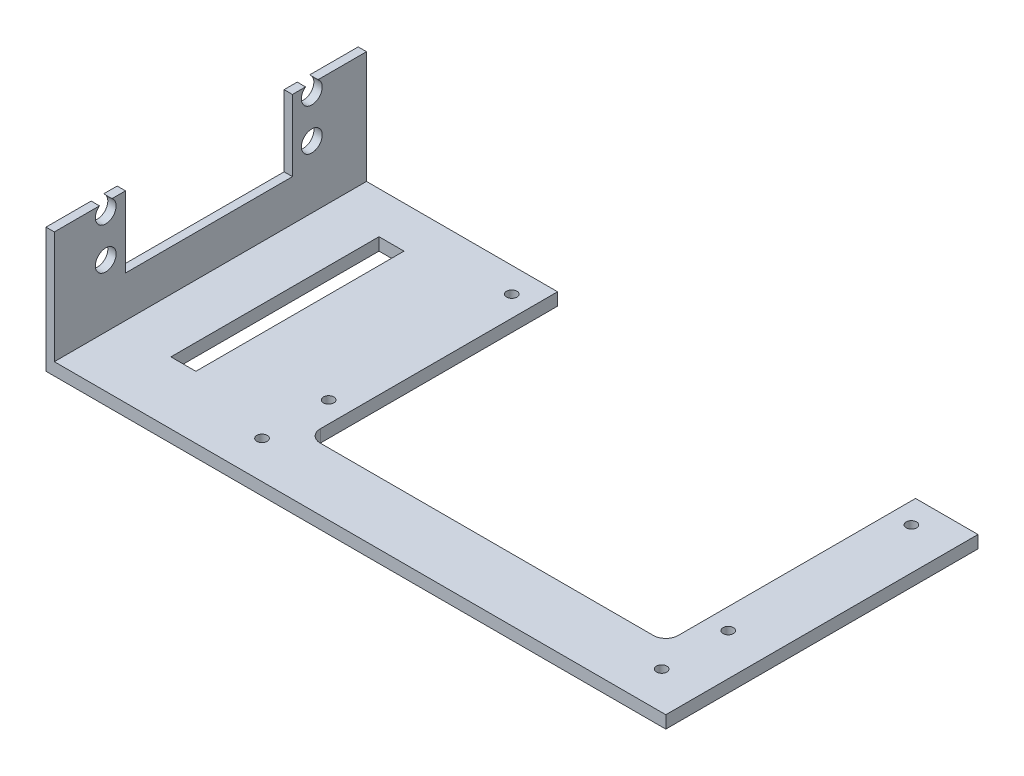
ISO-10303-21;
HEADER;
FILE_DESCRIPTION(('STEP AP214'),'2;1');
FILE_NAME('part.step','',(''),(''),'','','');
FILE_SCHEMA(('AUTOMOTIVE_DESIGN { 1 0 10303 214 1 1 1 1 }'));
ENDSEC;
DATA;
#1=APPLICATION_CONTEXT('core data for automotive mechanical design processes');
#2=APPLICATION_PROTOCOL_DEFINITION('international standard','automotive_design',2000,#1);
#3=PRODUCT_CONTEXT('',#1,'mechanical');
#4=PRODUCT('Part','Part','',(#3));
#5=PRODUCT_RELATED_PRODUCT_CATEGORY('part','',(#4));
#6=PRODUCT_DEFINITION_FORMATION('','',#4);
#7=PRODUCT_DEFINITION_CONTEXT('part definition',#1,'design');
#8=PRODUCT_DEFINITION('design','',#6,#7);
#9=PRODUCT_DEFINITION_SHAPE('','',#8);
#10=(LENGTH_UNIT() NAMED_UNIT(*) SI_UNIT(.MILLI.,.METRE.));
#11=(NAMED_UNIT(*) PLANE_ANGLE_UNIT() SI_UNIT($,.RADIAN.));
#12=(NAMED_UNIT(*) SI_UNIT($,.STERADIAN.) SOLID_ANGLE_UNIT());
#13=UNCERTAINTY_MEASURE_WITH_UNIT(LENGTH_MEASURE(1.E-05),#10,'distance_accuracy_value','');
#14=(GEOMETRIC_REPRESENTATION_CONTEXT(3) GLOBAL_UNCERTAINTY_ASSIGNED_CONTEXT((#13)) GLOBAL_UNIT_ASSIGNED_CONTEXT((#10,
#11,#12)) REPRESENTATION_CONTEXT('',''));
#15=CARTESIAN_POINT('',(0.,0.,0.));
#16=DIRECTION('',(0.,0.,1.));
#17=DIRECTION('',(1.,0.,0.));
#18=AXIS2_PLACEMENT_3D('',#15,#16,#17);
#19=CARTESIAN_POINT('',(0.,3.,0.));
#20=DIRECTION('',(0.,-1.,0.));
#21=DIRECTION('',(0.,0.,-1.));
#22=AXIS2_PLACEMENT_3D('',#19,#20,#21);
#23=PLANE('',#22);
#24=DIRECTION('',(1.,0.,0.));
#25=VECTOR('',#24,1.);
#26=CARTESIAN_POINT('',(-32.9,3.,0.));
#27=LINE('',#26,#25);
#28=CARTESIAN_POINT('',(-32.9,3.,0.));
#29=VERTEX_POINT('',#28);
#30=CARTESIAN_POINT('',(-26.9,3.,0.));
#31=VERTEX_POINT('',#30);
#32=EDGE_CURVE('E231',#29,#31,#27,.T.);
#33=ORIENTED_EDGE('',*,*,#32,.F.);
#34=DIRECTION('',(0.,0.,1.));
#35=VECTOR('',#34,1.);
#36=CARTESIAN_POINT('',(-32.9,3.,-50.));
#37=LINE('',#36,#35);
#38=CARTESIAN_POINT('',(-32.9,3.,-50.));
#39=VERTEX_POINT('',#38);
#40=EDGE_CURVE('E58',#39,#29,#37,.T.);
#41=ORIENTED_EDGE('',*,*,#40,.F.);
#42=DIRECTION('',(-1.,0.,0.));
#43=VECTOR('',#42,1.);
#44=CARTESIAN_POINT('',(-32.9,3.,-50.));
#45=LINE('',#44,#43);
#46=CARTESIAN_POINT('',(-26.9,3.,-50.));
#47=VERTEX_POINT('',#46);
#48=EDGE_CURVE('E222',#47,#39,#45,.T.);
#49=ORIENTED_EDGE('',*,*,#48,.F.);
#50=DIRECTION('',(0.,0.,-1.));
#51=VECTOR('',#50,1.);
#52=CARTESIAN_POINT('',(-26.9,3.,-50.));
#53=LINE('',#52,#51);
#54=EDGE_CURVE('E225',#31,#47,#53,.T.);
#55=ORIENTED_EDGE('',*,*,#54,.F.);
#56=EDGE_LOOP('',(#33,#41,#49,#55));
#57=FACE_BOUND('',#56,.T.);
#58=CARTESIAN_POINT('',(-5.,3.,-9.99999999999999));
#59=DIRECTION('',(0.,1.,0.));
#60=DIRECTION('',(0.,0.,-1.));
#61=AXIS2_PLACEMENT_3D('',#58,#59,#60);
#62=CIRCLE('',#61,1.25);
#63=CARTESIAN_POINT('',(-5.,3.,-11.25));
#64=VERTEX_POINT('',#63);
#65=EDGE_CURVE('E325',#64,#64,#62,.T.);
#66=ORIENTED_EDGE('',*,*,#65,.F.);
#67=EDGE_LOOP('',(#66));
#68=FACE_BOUND('',#67,.T.);
#69=CARTESIAN_POINT('',(91.,3.,-9.99999999999999));
#70=DIRECTION('',(0.,1.,0.));
#71=DIRECTION('',(0.,0.,1.));
#72=AXIS2_PLACEMENT_3D('',#69,#70,#71);
#73=CIRCLE('',#72,1.25);
#74=CARTESIAN_POINT('',(91.,3.,-8.75));
#75=VERTEX_POINT('',#74);
#76=EDGE_CURVE('E331',#75,#75,#73,.T.);
#77=ORIENTED_EDGE('',*,*,#76,.F.);
#78=EDGE_LOOP('',(#77));
#79=FACE_BOUND('',#78,.T.);
#80=CARTESIAN_POINT('',(91.,3.,6.00000000000001));
#81=DIRECTION('',(0.,1.,0.));
#82=DIRECTION('',(0.,0.,1.));
#83=AXIS2_PLACEMENT_3D('',#80,#81,#82);
#84=CIRCLE('',#83,1.25);
#85=CARTESIAN_POINT('',(91.,3.,7.25));
#86=VERTEX_POINT('',#85);
#87=EDGE_CURVE('E337',#86,#86,#84,.T.);
#88=ORIENTED_EDGE('',*,*,#87,.F.);
#89=EDGE_LOOP('',(#88));
#90=FACE_BOUND('',#89,.T.);
#91=CARTESIAN_POINT('',(91.,3.,-54.));
#92=DIRECTION('',(0.,1.,0.));
#93=DIRECTION('',(0.,0.,1.));
#94=AXIS2_PLACEMENT_3D('',#91,#92,#93);
#95=CIRCLE('',#94,1.25);
#96=CARTESIAN_POINT('',(91.,3.,-52.75));
#97=VERTEX_POINT('',#96);
#98=EDGE_CURVE('E343',#97,#97,#95,.T.);
#99=ORIENTED_EDGE('',*,*,#98,.F.);
#100=EDGE_LOOP('',(#99));
#101=FACE_BOUND('',#100,.T.);
#102=CARTESIAN_POINT('',(-5.,3.,6.00000000000001));
#103=DIRECTION('',(0.,1.,0.));
#104=DIRECTION('',(0.,0.,-1.));
#105=AXIS2_PLACEMENT_3D('',#102,#103,#104);
#106=CIRCLE('',#105,1.25);
#107=CARTESIAN_POINT('',(-5.,3.,4.75000000000001));
#108=VERTEX_POINT('',#107);
#109=EDGE_CURVE('E349',#108,#108,#106,.T.);
#110=ORIENTED_EDGE('',*,*,#109,.F.);
#111=EDGE_LOOP('',(#110));
#112=FACE_BOUND('',#111,.T.);
#113=CARTESIAN_POINT('',(-5.,3.,-54.));
#114=DIRECTION('',(0.,1.,0.));
#115=DIRECTION('',(0.,0.,1.));
#116=AXIS2_PLACEMENT_3D('',#113,#114,#115);
#117=CIRCLE('',#116,1.25);
#118=CARTESIAN_POINT('',(-5.,3.,-52.75));
#119=VERTEX_POINT('',#118);
#120=EDGE_CURVE('E355',#119,#119,#117,.T.);
#121=ORIENTED_EDGE('',*,*,#120,.F.);
#122=EDGE_LOOP('',(#121));
#123=FACE_BOUND('',#122,.T.);
#124=DIRECTION('',(0.,0.,-1.));
#125=VECTOR('',#124,1.);
#126=CARTESIAN_POINT('',(-45.9,3.,-60.));
#127=LINE('',#126,#125);
#128=CARTESIAN_POINT('',(-45.9,3.,15.));
#129=VERTEX_POINT('',#128);
#130=CARTESIAN_POINT('',(-45.9,3.,-60.));
#131=VERTEX_POINT('',#130);
#132=EDGE_CURVE('E307',#129,#131,#127,.T.);
#133=ORIENTED_EDGE('',*,*,#132,.F.);
#134=DIRECTION('',(1.,0.,0.));
#135=VECTOR('',#134,1.);
#136=CARTESIAN_POINT('',(-15.,3.,15.));
#137=LINE('',#136,#135);
#138=CARTESIAN_POINT('',(101.,3.,15.));
#139=VERTEX_POINT('',#138);
#140=EDGE_CURVE('E370',#129,#139,#137,.T.);
#141=ORIENTED_EDGE('',*,*,#140,.T.);
#142=DIRECTION('',(0.,0.,-1.));
#143=VECTOR('',#142,1.);
#144=CARTESIAN_POINT('',(101.,3.,15.));
#145=LINE('',#144,#143);
#146=CARTESIAN_POINT('',(101.,3.,-60.));
#147=VERTEX_POINT('',#146);
#148=EDGE_CURVE('E372',#139,#147,#145,.T.);
#149=ORIENTED_EDGE('',*,*,#148,.T.);
#150=DIRECTION('',(-1.,0.,0.));
#151=VECTOR('',#150,1.);
#152=CARTESIAN_POINT('',(101.,3.,-60.));
#153=LINE('',#152,#151);
#154=CARTESIAN_POINT('',(86.,3.,-60.));
#155=VERTEX_POINT('',#154);
#156=EDGE_CURVE('E374',#147,#155,#153,.T.);
#157=ORIENTED_EDGE('',*,*,#156,.T.);
#158=DIRECTION('',(0.,0.,1.));
#159=VECTOR('',#158,1.);
#160=CARTESIAN_POINT('',(86.,3.,-60.));
#161=LINE('',#160,#159);
#162=CARTESIAN_POINT('',(86.,3.,-3.));
#163=VERTEX_POINT('',#162);
#164=EDGE_CURVE('E376',#155,#163,#161,.T.);
#165=ORIENTED_EDGE('',*,*,#164,.T.);
#166=CARTESIAN_POINT('',(83.,3.,-3.));
#167=DIRECTION('',(0.,-1.,0.));
#168=DIRECTION('',(0.,0.,-1.));
#169=AXIS2_PLACEMENT_3D('',#166,#167,#168);
#170=CIRCLE('',#169,3.);
#171=CARTESIAN_POINT('',(83.,3.,0.));
#172=VERTEX_POINT('',#171);
#173=EDGE_CURVE('E418',#163,#172,#170,.T.);
#174=ORIENTED_EDGE('',*,*,#173,.T.);
#175=DIRECTION('',(-1.,0.,0.));
#176=VECTOR('',#175,1.);
#177=CARTESIAN_POINT('',(86.,3.,0.));
#178=LINE('',#177,#176);
#179=CARTESIAN_POINT('',(3.,3.,0.));
#180=VERTEX_POINT('',#179);
#181=EDGE_CURVE('E361',#172,#180,#178,.T.);
#182=ORIENTED_EDGE('',*,*,#181,.T.);
#183=CARTESIAN_POINT('',(3.,3.,-3.));
#184=DIRECTION('',(0.,-1.,0.));
#185=DIRECTION('',(0.,0.,-1.));
#186=AXIS2_PLACEMENT_3D('',#183,#184,#185);
#187=CIRCLE('',#186,3.);
#188=CARTESIAN_POINT('',(0.,3.,-3.));
#189=VERTEX_POINT('',#188);
#190=EDGE_CURVE('E422',#180,#189,#187,.T.);
#191=ORIENTED_EDGE('',*,*,#190,.T.);
#192=DIRECTION('',(0.,0.,-1.));
#193=VECTOR('',#192,1.);
#194=CARTESIAN_POINT('',(0.,3.,0.));
#195=LINE('',#194,#193);
#196=CARTESIAN_POINT('',(0.,3.,-60.));
#197=VERTEX_POINT('',#196);
#198=EDGE_CURVE('E364',#189,#197,#195,.T.);
#199=ORIENTED_EDGE('',*,*,#198,.T.);
#200=DIRECTION('',(-1.,0.,0.));
#201=VECTOR('',#200,1.);
#202=CARTESIAN_POINT('',(0.,3.,-60.));
#203=LINE('',#202,#201);
#204=EDGE_CURVE('E367',#197,#131,#203,.T.);
#205=ORIENTED_EDGE('',*,*,#204,.T.);
#206=EDGE_LOOP('',(#133,#141,#149,#157,#165,#174,#182,#191,#199,#205));
#207=FACE_BOUND('',#206,.T.);
#208=ADVANCED_FACE('F43',(#57,#68,#79,#90,#101,#112,#123,#207),#23,.F.);
#209=CARTESIAN_POINT('',(0.,0.,0.));
#210=DIRECTION('',(0.,-1.,0.));
#211=DIRECTION('',(0.,0.,-1.));
#212=AXIS2_PLACEMENT_3D('',#209,#210,#211);
#213=PLANE('',#212);
#214=DIRECTION('',(0.,0.,1.));
#215=VECTOR('',#214,1.);
#216=CARTESIAN_POINT('',(-32.9,0.,-50.));
#217=LINE('',#216,#215);
#218=CARTESIAN_POINT('',(-32.9,0.,-50.));
#219=VERTEX_POINT('',#218);
#220=CARTESIAN_POINT('',(-32.9,0.,0.));
#221=VERTEX_POINT('',#220);
#222=EDGE_CURVE('E206',#219,#221,#217,.T.);
#223=ORIENTED_EDGE('',*,*,#222,.T.);
#224=DIRECTION('',(1.,0.,0.));
#225=VECTOR('',#224,1.);
#226=CARTESIAN_POINT('',(-32.9,0.,0.));
#227=LINE('',#226,#225);
#228=CARTESIAN_POINT('',(-26.9,0.,0.));
#229=VERTEX_POINT('',#228);
#230=EDGE_CURVE('E215',#221,#229,#227,.T.);
#231=ORIENTED_EDGE('',*,*,#230,.T.);
#232=DIRECTION('',(0.,0.,-1.));
#233=VECTOR('',#232,1.);
#234=CARTESIAN_POINT('',(-26.9,0.,-50.));
#235=LINE('',#234,#233);
#236=CARTESIAN_POINT('',(-26.9,0.,-50.));
#237=VERTEX_POINT('',#236);
#238=EDGE_CURVE('E66',#229,#237,#235,.T.);
#239=ORIENTED_EDGE('',*,*,#238,.T.);
#240=DIRECTION('',(-1.,0.,0.));
#241=VECTOR('',#240,1.);
#242=CARTESIAN_POINT('',(-32.9,0.,-50.));
#243=LINE('',#242,#241);
#244=EDGE_CURVE('E212',#237,#219,#243,.T.);
#245=ORIENTED_EDGE('',*,*,#244,.T.);
#246=EDGE_LOOP('',(#223,#231,#239,#245));
#247=FACE_BOUND('',#246,.T.);
#248=CARTESIAN_POINT('',(91.,0.,-9.99999999999999));
#249=DIRECTION('',(0.,1.,0.));
#250=DIRECTION('',(0.,0.,1.));
#251=AXIS2_PLACEMENT_3D('',#248,#249,#250);
#252=CIRCLE('',#251,1.25);
#253=CARTESIAN_POINT('',(91.,0.,-8.75));
#254=VERTEX_POINT('',#253);
#255=EDGE_CURVE('E328',#254,#254,#252,.T.);
#256=ORIENTED_EDGE('',*,*,#255,.T.);
#257=EDGE_LOOP('',(#256));
#258=FACE_BOUND('',#257,.T.);
#259=CARTESIAN_POINT('',(91.,0.,-54.));
#260=DIRECTION('',(0.,1.,0.));
#261=DIRECTION('',(0.,0.,1.));
#262=AXIS2_PLACEMENT_3D('',#259,#260,#261);
#263=CIRCLE('',#262,1.25);
#264=CARTESIAN_POINT('',(91.,0.,-52.75));
#265=VERTEX_POINT('',#264);
#266=EDGE_CURVE('E340',#265,#265,#263,.T.);
#267=ORIENTED_EDGE('',*,*,#266,.T.);
#268=EDGE_LOOP('',(#267));
#269=FACE_BOUND('',#268,.T.);
#270=CARTESIAN_POINT('',(-5.,0.,-54.));
#271=DIRECTION('',(0.,1.,0.));
#272=DIRECTION('',(0.,0.,1.));
#273=AXIS2_PLACEMENT_3D('',#270,#271,#272);
#274=CIRCLE('',#273,1.25);
#275=CARTESIAN_POINT('',(-5.,0.,-52.75));
#276=VERTEX_POINT('',#275);
#277=EDGE_CURVE('E352',#276,#276,#274,.T.);
#278=ORIENTED_EDGE('',*,*,#277,.T.);
#279=EDGE_LOOP('',(#278));
#280=FACE_BOUND('',#279,.T.);
#281=DIRECTION('',(-1.,0.,0.));
#282=VECTOR('',#281,1.);
#283=CARTESIAN_POINT('',(86.,0.,0.));
#284=LINE('',#283,#282);
#285=CARTESIAN_POINT('',(83.,0.,0.));
#286=VERTEX_POINT('',#285);
#287=CARTESIAN_POINT('',(3.,0.,0.));
#288=VERTEX_POINT('',#287);
#289=EDGE_CURVE('E358',#286,#288,#284,.T.);
#290=ORIENTED_EDGE('',*,*,#289,.F.);
#291=CARTESIAN_POINT('',(83.,0.,-3.));
#292=DIRECTION('',(0.,-1.,0.));
#293=DIRECTION('',(0.,0.,-1.));
#294=AXIS2_PLACEMENT_3D('',#291,#292,#293);
#295=CIRCLE('',#294,3.);
#296=CARTESIAN_POINT('',(86.,0.,-3.));
#297=VERTEX_POINT('',#296);
#298=EDGE_CURVE('E416',#286,#297,#295,.F.);
#299=ORIENTED_EDGE('',*,*,#298,.T.);
#300=DIRECTION('',(0.,0.,1.));
#301=VECTOR('',#300,1.);
#302=CARTESIAN_POINT('',(86.,0.,-60.));
#303=LINE('',#302,#301);
#304=CARTESIAN_POINT('',(86.,0.,-60.));
#305=VERTEX_POINT('',#304);
#306=EDGE_CURVE('E365',#305,#297,#303,.T.);
#307=ORIENTED_EDGE('',*,*,#306,.F.);
#308=DIRECTION('',(-1.,0.,0.));
#309=VECTOR('',#308,1.);
#310=CARTESIAN_POINT('',(101.,0.,-60.));
#311=LINE('',#310,#309);
#312=CARTESIAN_POINT('',(101.,0.,-60.));
#313=VERTEX_POINT('',#312);
#314=EDGE_CURVE('E391',#313,#305,#311,.T.);
#315=ORIENTED_EDGE('',*,*,#314,.F.);
#316=DIRECTION('',(0.,0.,-1.));
#317=VECTOR('',#316,1.);
#318=CARTESIAN_POINT('',(101.,0.,15.));
#319=LINE('',#318,#317);
#320=CARTESIAN_POINT('',(101.,0.,15.));
#321=VERTEX_POINT('',#320);
#322=EDGE_CURVE('E389',#321,#313,#319,.T.);
#323=ORIENTED_EDGE('',*,*,#322,.F.);
#324=DIRECTION('',(1.,0.,0.));
#325=VECTOR('',#324,1.);
#326=CARTESIAN_POINT('',(-15.,0.,15.));
#327=LINE('',#326,#325);
#328=CARTESIAN_POINT('',(-47.8999999999999,0.,15.));
#329=VERTEX_POINT('',#328);
#330=EDGE_CURVE('E387',#329,#321,#327,.T.);
#331=ORIENTED_EDGE('',*,*,#330,.F.);
#332=DIRECTION('',(0.,0.,1.));
#333=VECTOR('',#332,1.);
#334=CARTESIAN_POINT('',(-47.9,0.,-60.));
#335=LINE('',#334,#333);
#336=CARTESIAN_POINT('',(-47.9,0.,-60.));
#337=VERTEX_POINT('',#336);
#338=EDGE_CURVE('E321',#337,#329,#335,.T.);
#339=ORIENTED_EDGE('',*,*,#338,.F.);
#340=DIRECTION('',(-1.,0.,0.));
#341=VECTOR('',#340,1.);
#342=CARTESIAN_POINT('',(0.,0.,-60.));
#343=LINE('',#342,#341);
#344=CARTESIAN_POINT('',(0.,0.,-60.));
#345=VERTEX_POINT('',#344);
#346=EDGE_CURVE('E384',#345,#337,#343,.T.);
#347=ORIENTED_EDGE('',*,*,#346,.F.);
#348=DIRECTION('',(0.,0.,-1.));
#349=VECTOR('',#348,1.);
#350=CARTESIAN_POINT('',(0.,0.,0.));
#351=LINE('',#350,#349);
#352=CARTESIAN_POINT('',(0.,0.,-3.));
#353=VERTEX_POINT('',#352);
#354=EDGE_CURVE('E382',#353,#345,#351,.T.);
#355=ORIENTED_EDGE('',*,*,#354,.F.);
#356=CARTESIAN_POINT('',(3.,0.,-3.));
#357=DIRECTION('',(0.,-1.,0.));
#358=DIRECTION('',(0.,0.,-1.));
#359=AXIS2_PLACEMENT_3D('',#356,#357,#358);
#360=CIRCLE('',#359,3.);
#361=EDGE_CURVE('E420',#353,#288,#360,.F.);
#362=ORIENTED_EDGE('',*,*,#361,.T.);
#363=EDGE_LOOP('',(#290,#299,#307,#315,#323,#331,#339,#347,#355,#362));
#364=FACE_BOUND('',#363,.T.);
#365=CARTESIAN_POINT('',(-5.,0.,6.00000000000001));
#366=DIRECTION('',(0.,1.,0.));
#367=DIRECTION('',(0.,0.,-1.));
#368=AXIS2_PLACEMENT_3D('',#365,#366,#367);
#369=CIRCLE('',#368,1.25);
#370=CARTESIAN_POINT('',(-5.,0.,4.75000000000001));
#371=VERTEX_POINT('',#370);
#372=EDGE_CURVE('E346',#371,#371,#369,.T.);
#373=ORIENTED_EDGE('',*,*,#372,.T.);
#374=EDGE_LOOP('',(#373));
#375=FACE_BOUND('',#374,.T.);
#376=CARTESIAN_POINT('',(91.,0.,6.00000000000001));
#377=DIRECTION('',(0.,1.,0.));
#378=DIRECTION('',(0.,0.,1.));
#379=AXIS2_PLACEMENT_3D('',#376,#377,#378);
#380=CIRCLE('',#379,1.25);
#381=CARTESIAN_POINT('',(91.,0.,7.25));
#382=VERTEX_POINT('',#381);
#383=EDGE_CURVE('E334',#382,#382,#380,.T.);
#384=ORIENTED_EDGE('',*,*,#383,.T.);
#385=EDGE_LOOP('',(#384));
#386=FACE_BOUND('',#385,.T.);
#387=CARTESIAN_POINT('',(-5.,0.,-9.99999999999999));
#388=DIRECTION('',(0.,1.,0.));
#389=DIRECTION('',(0.,0.,-1.));
#390=AXIS2_PLACEMENT_3D('',#387,#388,#389);
#391=CIRCLE('',#390,1.25);
#392=CARTESIAN_POINT('',(-5.,0.,-11.25));
#393=VERTEX_POINT('',#392);
#394=EDGE_CURVE('E320',#393,#393,#391,.T.);
#395=ORIENTED_EDGE('',*,*,#394,.T.);
#396=EDGE_LOOP('',(#395));
#397=FACE_BOUND('',#396,.T.);
#398=ADVANCED_FACE('F219',(#247,#258,#269,#280,#364,#375,#386,#397),#213,.T.);
#399=CARTESIAN_POINT('',(86.,3.,0.));
#400=DIRECTION('',(0.,0.,1.));
#401=DIRECTION('',(1.,0.,0.));
#402=AXIS2_PLACEMENT_3D('',#399,#400,#401);
#403=PLANE('',#402);
#404=ORIENTED_EDGE('',*,*,#181,.F.);
#405=DIRECTION('',(0.,-1.,0.));
#406=VECTOR('',#405,1.);
#407=CARTESIAN_POINT('',(83.,0.,0.));
#408=LINE('',#407,#406);
#409=EDGE_CURVE('E408',#172,#286,#408,.T.);
#410=ORIENTED_EDGE('',*,*,#409,.T.);
#411=ORIENTED_EDGE('',*,*,#289,.T.);
#412=DIRECTION('',(0.,-1.,0.));
#413=VECTOR('',#412,1.);
#414=CARTESIAN_POINT('',(3.,3.,0.));
#415=LINE('',#414,#413);
#416=EDGE_CURVE('E406',#288,#180,#415,.F.);
#417=ORIENTED_EDGE('',*,*,#416,.T.);
#418=EDGE_LOOP('',(#404,#410,#411,#417));
#419=FACE_BOUND('',#418,.T.);
#420=ADVANCED_FACE('F506',(#419),#403,.F.);
#421=CARTESIAN_POINT('',(0.,3.,0.));
#422=DIRECTION('',(-1.,0.,0.));
#423=DIRECTION('',(0.,0.,1.));
#424=AXIS2_PLACEMENT_3D('',#421,#422,#423);
#425=PLANE('',#424);
#426=ORIENTED_EDGE('',*,*,#198,.F.);
#427=DIRECTION('',(0.,-1.,0.));
#428=VECTOR('',#427,1.);
#429=CARTESIAN_POINT('',(0.,0.,-3.));
#430=LINE('',#429,#428);
#431=EDGE_CURVE('E413',#189,#353,#430,.T.);
#432=ORIENTED_EDGE('',*,*,#431,.T.);
#433=ORIENTED_EDGE('',*,*,#354,.T.);
#434=DIRECTION('',(0.,-1.,0.));
#435=VECTOR('',#434,1.);
#436=CARTESIAN_POINT('',(0.,3.,-60.));
#437=LINE('',#436,#435);
#438=EDGE_CURVE('E403',#197,#345,#437,.T.);
#439=ORIENTED_EDGE('',*,*,#438,.F.);
#440=EDGE_LOOP('',(#426,#432,#433,#439));
#441=FACE_BOUND('',#440,.T.);
#442=ADVANCED_FACE('F500',(#441),#425,.F.);
#443=CARTESIAN_POINT('',(0.,3.,-60.));
#444=DIRECTION('',(0.,0.,1.));
#445=DIRECTION('',(1.,0.,0.));
#446=AXIS2_PLACEMENT_3D('',#443,#444,#445);
#447=PLANE('',#446);
#448=DIRECTION('',(0.,-1.,0.));
#449=VECTOR('',#448,1.);
#450=CARTESIAN_POINT('',(-47.9,2.99999999999989,-60.));
#451=LINE('',#450,#449);
#452=CARTESIAN_POINT('',(-47.9,30.,-60.));
#453=VERTEX_POINT('',#452);
#454=EDGE_CURVE('E316',#453,#337,#451,.T.);
#455=ORIENTED_EDGE('',*,*,#454,.F.);
#456=DIRECTION('',(-1.,0.,0.));
#457=VECTOR('',#456,1.);
#458=CARTESIAN_POINT('',(-47.9,30.,-60.));
#459=LINE('',#458,#457);
#460=CARTESIAN_POINT('',(-45.9,30.,-60.));
#461=VERTEX_POINT('',#460);
#462=EDGE_CURVE('E249',#461,#453,#459,.T.);
#463=ORIENTED_EDGE('',*,*,#462,.F.);
#464=DIRECTION('',(0.,-1.,0.));
#465=VECTOR('',#464,1.);
#466=CARTESIAN_POINT('',(-45.9,33.,-60.));
#467=LINE('',#466,#465);
#468=EDGE_CURVE('E312',#461,#131,#467,.T.);
#469=ORIENTED_EDGE('',*,*,#468,.T.);
#470=ORIENTED_EDGE('',*,*,#204,.F.);
#471=ORIENTED_EDGE('',*,*,#438,.T.);
#472=ORIENTED_EDGE('',*,*,#346,.T.);
#473=EDGE_LOOP('',(#455,#463,#469,#470,#471,#472));
#474=FACE_BOUND('',#473,.T.);
#475=ADVANCED_FACE('F496',(#474),#447,.F.);
#476=CARTESIAN_POINT('',(-15.,3.,15.));
#477=DIRECTION('',(0.,0.,-1.));
#478=DIRECTION('',(-1.,0.,0.));
#479=AXIS2_PLACEMENT_3D('',#476,#477,#478);
#480=PLANE('',#479);
#481=DIRECTION('',(0.,-1.,0.));
#482=VECTOR('',#481,1.);
#483=CARTESIAN_POINT('',(-45.9,33.,15.));
#484=LINE('',#483,#482);
#485=CARTESIAN_POINT('',(-45.9,30.,15.));
#486=VERTEX_POINT('',#485);
#487=EDGE_CURVE('E314',#486,#129,#484,.T.);
#488=ORIENTED_EDGE('',*,*,#487,.F.);
#489=DIRECTION('',(1.,0.,0.));
#490=VECTOR('',#489,1.);
#491=CARTESIAN_POINT('',(-45.9,30.,15.));
#492=LINE('',#491,#490);
#493=CARTESIAN_POINT('',(-47.9,30.,15.));
#494=VERTEX_POINT('',#493);
#495=EDGE_CURVE('E243',#494,#486,#492,.T.);
#496=ORIENTED_EDGE('',*,*,#495,.F.);
#497=DIRECTION('',(0.,1.,0.));
#498=VECTOR('',#497,1.);
#499=CARTESIAN_POINT('',(-47.8999999999999,-1.06279199563464E-13,15.));
#500=LINE('',#499,#498);
#501=EDGE_CURVE('E317',#329,#494,#500,.T.);
#502=ORIENTED_EDGE('',*,*,#501,.F.);
#503=ORIENTED_EDGE('',*,*,#330,.T.);
#504=DIRECTION('',(0.,-1.,0.));
#505=VECTOR('',#504,1.);
#506=CARTESIAN_POINT('',(101.,3.,15.));
#507=LINE('',#506,#505);
#508=EDGE_CURVE('E400',#139,#321,#507,.T.);
#509=ORIENTED_EDGE('',*,*,#508,.F.);
#510=ORIENTED_EDGE('',*,*,#140,.F.);
#511=EDGE_LOOP('',(#488,#496,#502,#503,#509,#510));
#512=FACE_BOUND('',#511,.T.);
#513=ADVANCED_FACE('F449',(#512),#480,.F.);
#514=CARTESIAN_POINT('',(101.,3.,15.));
#515=DIRECTION('',(-1.,0.,0.));
#516=DIRECTION('',(0.,0.,1.));
#517=AXIS2_PLACEMENT_3D('',#514,#515,#516);
#518=PLANE('',#517);
#519=ORIENTED_EDGE('',*,*,#322,.T.);
#520=DIRECTION('',(0.,-1.,0.));
#521=VECTOR('',#520,1.);
#522=CARTESIAN_POINT('',(101.,3.,-60.));
#523=LINE('',#522,#521);
#524=EDGE_CURVE('E397',#147,#313,#523,.T.);
#525=ORIENTED_EDGE('',*,*,#524,.F.);
#526=ORIENTED_EDGE('',*,*,#148,.F.);
#527=ORIENTED_EDGE('',*,*,#508,.T.);
#528=EDGE_LOOP('',(#519,#525,#526,#527));
#529=FACE_BOUND('',#528,.T.);
#530=ADVANCED_FACE('F462',(#529),#518,.F.);
#531=CARTESIAN_POINT('',(101.,3.,-60.));
#532=DIRECTION('',(0.,0.,1.));
#533=DIRECTION('',(1.,0.,0.));
#534=AXIS2_PLACEMENT_3D('',#531,#532,#533);
#535=PLANE('',#534);
#536=ORIENTED_EDGE('',*,*,#314,.T.);
#537=DIRECTION('',(0.,-1.,0.));
#538=VECTOR('',#537,1.);
#539=CARTESIAN_POINT('',(86.,3.,-60.));
#540=LINE('',#539,#538);
#541=EDGE_CURVE('E379',#155,#305,#540,.T.);
#542=ORIENTED_EDGE('',*,*,#541,.F.);
#543=ORIENTED_EDGE('',*,*,#156,.F.);
#544=ORIENTED_EDGE('',*,*,#524,.T.);
#545=EDGE_LOOP('',(#536,#542,#543,#544));
#546=FACE_BOUND('',#545,.T.);
#547=ADVANCED_FACE('F518',(#546),#535,.F.);
#548=CARTESIAN_POINT('',(86.,3.,-60.));
#549=DIRECTION('',(1.,0.,0.));
#550=DIRECTION('',(0.,0.,-1.));
#551=AXIS2_PLACEMENT_3D('',#548,#549,#550);
#552=PLANE('',#551);
#553=ORIENTED_EDGE('',*,*,#306,.T.);
#554=DIRECTION('',(0.,-1.,0.));
#555=VECTOR('',#554,1.);
#556=CARTESIAN_POINT('',(86.,3.,-3.));
#557=LINE('',#556,#555);
#558=EDGE_CURVE('E411',#297,#163,#557,.F.);
#559=ORIENTED_EDGE('',*,*,#558,.T.);
#560=ORIENTED_EDGE('',*,*,#164,.F.);
#561=ORIENTED_EDGE('',*,*,#541,.T.);
#562=EDGE_LOOP('',(#553,#559,#560,#561));
#563=FACE_BOUND('',#562,.T.);
#564=ADVANCED_FACE('F515',(#563),#552,.F.);
#565=CARTESIAN_POINT('',(-5.,3.,-54.));
#566=DIRECTION('',(0.,-1.,0.));
#567=DIRECTION('',(0.,0.,-1.));
#568=AXIS2_PLACEMENT_3D('',#565,#566,#567);
#569=CYLINDRICAL_SURFACE('',#568,1.25);
#570=ORIENTED_EDGE('',*,*,#120,.T.);
#571=EDGE_LOOP('',(#570));
#572=FACE_BOUND('',#571,.T.);
#573=ORIENTED_EDGE('',*,*,#277,.F.);
#574=EDGE_LOOP('',(#573));
#575=FACE_BOUND('',#574,.T.);
#576=ADVANCED_FACE('F526',(#572,#575),#569,.F.);
#577=CARTESIAN_POINT('',(-5.,3.,6.00000000000001));
#578=DIRECTION('',(0.,-1.,0.));
#579=DIRECTION('',(0.,0.,-1.));
#580=AXIS2_PLACEMENT_3D('',#577,#578,#579);
#581=CYLINDRICAL_SURFACE('',#580,1.25);
#582=ORIENTED_EDGE('',*,*,#109,.T.);
#583=EDGE_LOOP('',(#582));
#584=FACE_BOUND('',#583,.T.);
#585=ORIENTED_EDGE('',*,*,#372,.F.);
#586=EDGE_LOOP('',(#585));
#587=FACE_BOUND('',#586,.T.);
#588=ADVANCED_FACE('F541',(#584,#587),#581,.F.);
#589=CARTESIAN_POINT('',(91.,3.,-54.));
#590=DIRECTION('',(0.,-1.,0.));
#591=DIRECTION('',(0.,0.,-1.));
#592=AXIS2_PLACEMENT_3D('',#589,#590,#591);
#593=CYLINDRICAL_SURFACE('',#592,1.25);
#594=ORIENTED_EDGE('',*,*,#98,.T.);
#595=EDGE_LOOP('',(#594));
#596=FACE_BOUND('',#595,.T.);
#597=ORIENTED_EDGE('',*,*,#266,.F.);
#598=EDGE_LOOP('',(#597));
#599=FACE_BOUND('',#598,.T.);
#600=ADVANCED_FACE('F545',(#596,#599),#593,.F.);
#601=CARTESIAN_POINT('',(91.,3.,6.00000000000001));
#602=DIRECTION('',(0.,-1.,0.));
#603=DIRECTION('',(0.,0.,-1.));
#604=AXIS2_PLACEMENT_3D('',#601,#602,#603);
#605=CYLINDRICAL_SURFACE('',#604,1.25);
#606=ORIENTED_EDGE('',*,*,#87,.T.);
#607=EDGE_LOOP('',(#606));
#608=FACE_BOUND('',#607,.T.);
#609=ORIENTED_EDGE('',*,*,#383,.F.);
#610=EDGE_LOOP('',(#609));
#611=FACE_BOUND('',#610,.T.);
#612=ADVANCED_FACE('F549',(#608,#611),#605,.F.);
#613=CARTESIAN_POINT('',(91.,3.,-9.99999999999999));
#614=DIRECTION('',(0.,-1.,0.));
#615=DIRECTION('',(0.,0.,-1.));
#616=AXIS2_PLACEMENT_3D('',#613,#614,#615);
#617=CYLINDRICAL_SURFACE('',#616,1.25);
#618=ORIENTED_EDGE('',*,*,#76,.T.);
#619=EDGE_LOOP('',(#618));
#620=FACE_BOUND('',#619,.T.);
#621=ORIENTED_EDGE('',*,*,#255,.F.);
#622=EDGE_LOOP('',(#621));
#623=FACE_BOUND('',#622,.T.);
#624=ADVANCED_FACE('F553',(#620,#623),#617,.F.);
#625=CARTESIAN_POINT('',(-5.,3.,-9.99999999999999));
#626=DIRECTION('',(0.,-1.,0.));
#627=DIRECTION('',(0.,0.,-1.));
#628=AXIS2_PLACEMENT_3D('',#625,#626,#627);
#629=CYLINDRICAL_SURFACE('',#628,1.25);
#630=ORIENTED_EDGE('',*,*,#65,.T.);
#631=EDGE_LOOP('',(#630));
#632=FACE_BOUND('',#631,.T.);
#633=ORIENTED_EDGE('',*,*,#394,.F.);
#634=EDGE_LOOP('',(#633));
#635=FACE_BOUND('',#634,.T.);
#636=ADVANCED_FACE('F557',(#632,#635),#629,.F.);
#637=CARTESIAN_POINT('',(83.,3.,-3.));
#638=DIRECTION('',(0.,1.,0.));
#639=DIRECTION('',(0.,0.,1.));
#640=AXIS2_PLACEMENT_3D('',#637,#638,#639);
#641=CYLINDRICAL_SURFACE('',#640,3.);
#642=ORIENTED_EDGE('',*,*,#173,.F.);
#643=ORIENTED_EDGE('',*,*,#558,.F.);
#644=ORIENTED_EDGE('',*,*,#298,.F.);
#645=ORIENTED_EDGE('',*,*,#409,.F.);
#646=EDGE_LOOP('',(#642,#643,#644,#645));
#647=FACE_BOUND('',#646,.T.);
#648=ADVANCED_FACE('F511',(#647),#641,.F.);
#649=CARTESIAN_POINT('',(3.,3.,-3.));
#650=DIRECTION('',(0.,1.,0.));
#651=DIRECTION('',(0.,0.,1.));
#652=AXIS2_PLACEMENT_3D('',#649,#650,#651);
#653=CYLINDRICAL_SURFACE('',#652,3.);
#654=ORIENTED_EDGE('',*,*,#190,.F.);
#655=ORIENTED_EDGE('',*,*,#416,.F.);
#656=ORIENTED_EDGE('',*,*,#361,.F.);
#657=ORIENTED_EDGE('',*,*,#431,.F.);
#658=EDGE_LOOP('',(#654,#655,#656,#657));
#659=FACE_BOUND('',#658,.T.);
#660=ADVANCED_FACE('F45',(#659),#653,.F.);
#661=CARTESIAN_POINT('',(-47.9,27.9999999999996,-46.8500000000015));
#662=DIRECTION('',(-1.,0.,0.));
#663=DIRECTION('',(0.,1.,0.));
#664=AXIS2_PLACEMENT_3D('',#661,#662,#663);
#665=PLANE('',#664);
#666=DIRECTION('',(0.,0.,1.));
#667=VECTOR('',#666,1.);
#668=CARTESIAN_POINT('',(-47.9,30.,15.));
#669=LINE('',#668,#667);
#670=CARTESIAN_POINT('',(-47.9,30.0000000000002,-48.3500000000034));
#671=VERTEX_POINT('',#670);
#672=EDGE_CURVE('E241',#453,#671,#669,.T.);
#673=ORIENTED_EDGE('',*,*,#672,.F.);
#674=ORIENTED_EDGE('',*,*,#454,.T.);
#675=ORIENTED_EDGE('',*,*,#338,.T.);
#676=ORIENTED_EDGE('',*,*,#501,.T.);
#677=CARTESIAN_POINT('',(-47.9,30.,4.15000000000042));
#678=VERTEX_POINT('',#677);
#679=EDGE_CURVE('E237',#678,#494,#669,.T.);
#680=ORIENTED_EDGE('',*,*,#679,.F.);
#681=CARTESIAN_POINT('',(-47.8999999999999,27.9999999999998,2.64999999999843));
#682=DIRECTION('',(-1.,0.,0.));
#683=DIRECTION('',(0.,-1.,0.));
#684=AXIS2_PLACEMENT_3D('',#681,#682,#683);
#685=CIRCLE('',#684,2.50000000000156);
#686=CARTESIAN_POINT('',(-47.8999999999999,30.0000000000002,1.14999999999644));
#687=VERTEX_POINT('',#686);
#688=EDGE_CURVE('E267',#687,#678,#685,.T.);
#689=ORIENTED_EDGE('',*,*,#688,.F.);
#690=CARTESIAN_POINT('',(-47.9,30.,-2.09999999999999));
#691=VERTEX_POINT('',#690);
#692=EDGE_CURVE('E437',#691,#687,#669,.T.);
#693=ORIENTED_EDGE('',*,*,#692,.F.);
#694=DIRECTION('',(0.,-1.,0.));
#695=VECTOR('',#694,1.);
#696=CARTESIAN_POINT('',(-47.8999999999999,33.,-2.09999999999999));
#697=LINE('',#696,#695);
#698=CARTESIAN_POINT('',(-47.8999999999999,12.9,-2.09999999999999));
#699=VERTEX_POINT('',#698);
#700=EDGE_CURVE('E288',#691,#699,#697,.T.);
#701=ORIENTED_EDGE('',*,*,#700,.T.);
#702=DIRECTION('',(0.,0.,-1.));
#703=VECTOR('',#702,1.);
#704=CARTESIAN_POINT('',(-47.9,12.9,-42.2));
#705=LINE('',#704,#703);
#706=CARTESIAN_POINT('',(-47.9,12.9,-42.2));
#707=VERTEX_POINT('',#706);
#708=EDGE_CURVE('E290',#699,#707,#705,.T.);
#709=ORIENTED_EDGE('',*,*,#708,.T.);
#710=DIRECTION('',(0.,1.,0.));
#711=VECTOR('',#710,1.);
#712=CARTESIAN_POINT('',(-47.8999999999999,33.,-42.2));
#713=LINE('',#712,#711);
#714=CARTESIAN_POINT('',(-47.9,30.,-42.2));
#715=VERTEX_POINT('',#714);
#716=EDGE_CURVE('E293',#707,#715,#713,.T.);
#717=ORIENTED_EDGE('',*,*,#716,.T.);
#718=CARTESIAN_POINT('',(-47.9,30.,-45.3499999999997));
#719=VERTEX_POINT('',#718);
#720=EDGE_CURVE('E244',#719,#715,#669,.T.);
#721=ORIENTED_EDGE('',*,*,#720,.F.);
#722=CARTESIAN_POINT('',(-47.9,27.9999999999996,-46.8500000000015));
#723=DIRECTION('',(-1.,0.,0.));
#724=DIRECTION('',(0.,-1.,0.));
#725=AXIS2_PLACEMENT_3D('',#722,#723,#724);
#726=CIRCLE('',#725,2.50000000000159);
#727=EDGE_CURVE('E274',#671,#719,#726,.T.);
#728=ORIENTED_EDGE('',*,*,#727,.F.);
#729=EDGE_LOOP('',(#673,#674,#675,#676,#680,#689,#693,#701,#709,#717,#721,#728));
#730=FACE_BOUND('',#729,.T.);
#731=CARTESIAN_POINT('',(-47.8999999999999,17.9999999999998,2.64999999999846));
#732=DIRECTION('',(-1.,0.,0.));
#733=DIRECTION('',(0.,-1.,0.));
#734=AXIS2_PLACEMENT_3D('',#731,#732,#733);
#735=CIRCLE('',#734,2.50000000000153);
#736=CARTESIAN_POINT('',(-47.8999999999999,15.4999999999982,2.64999999999846));
#737=VERTEX_POINT('',#736);
#738=EDGE_CURVE('E275',#737,#737,#735,.T.);
#739=ORIENTED_EDGE('',*,*,#738,.F.);
#740=EDGE_LOOP('',(#739));
#741=FACE_BOUND('',#740,.T.);
#742=CARTESIAN_POINT('',(-47.9,17.9999999999996,-46.8500000000015));
#743=DIRECTION('',(-1.,0.,0.));
#744=DIRECTION('',(0.,-1.,0.));
#745=AXIS2_PLACEMENT_3D('',#742,#743,#744);
#746=CIRCLE('',#745,2.50000000000157);
#747=CARTESIAN_POINT('',(-47.9,15.499999999998,-46.8500000000015));
#748=VERTEX_POINT('',#747);
#749=EDGE_CURVE('E278',#748,#748,#746,.T.);
#750=ORIENTED_EDGE('',*,*,#749,.F.);
#751=EDGE_LOOP('',(#750));
#752=FACE_BOUND('',#751,.T.);
#753=ADVANCED_FACE('F433',(#730,#741,#752),#665,.T.);
#754=CARTESIAN_POINT('',(-45.9,33.,-60.));
#755=DIRECTION('',(-1.,0.,0.));
#756=DIRECTION('',(0.,0.,1.));
#757=AXIS2_PLACEMENT_3D('',#754,#755,#756);
#758=PLANE('',#757);
#759=ORIENTED_EDGE('',*,*,#468,.F.);
#760=DIRECTION('',(0.,0.,-1.));
#761=VECTOR('',#760,1.);
#762=CARTESIAN_POINT('',(-45.9,30.,-60.));
#763=LINE('',#762,#761);
#764=CARTESIAN_POINT('',(-45.9,30.,-48.3500000000034));
#765=VERTEX_POINT('',#764);
#766=EDGE_CURVE('E246',#765,#461,#763,.T.);
#767=ORIENTED_EDGE('',*,*,#766,.F.);
#768=CARTESIAN_POINT('',(-45.9,27.9999999999996,-46.8500000000015));
#769=DIRECTION('',(-1.,0.,0.));
#770=DIRECTION('',(0.,0.,1.));
#771=AXIS2_PLACEMENT_3D('',#768,#769,#770);
#772=CIRCLE('',#771,2.50000000000159);
#773=CARTESIAN_POINT('',(-45.9,30.0000000000002,-45.3499999999997));
#774=VERTEX_POINT('',#773);
#775=EDGE_CURVE('E271',#774,#765,#772,.F.);
#776=ORIENTED_EDGE('',*,*,#775,.F.);
#777=CARTESIAN_POINT('',(-45.9,30.,-42.2));
#778=VERTEX_POINT('',#777);
#779=EDGE_CURVE('E489',#778,#774,#763,.T.);
#780=ORIENTED_EDGE('',*,*,#779,.F.);
#781=DIRECTION('',(0.,1.,0.));
#782=VECTOR('',#781,1.);
#783=CARTESIAN_POINT('',(-45.9,33.,-42.2));
#784=LINE('',#783,#782);
#785=CARTESIAN_POINT('',(-45.9,12.9,-42.2));
#786=VERTEX_POINT('',#785);
#787=EDGE_CURVE('E296',#786,#778,#784,.T.);
#788=ORIENTED_EDGE('',*,*,#787,.F.);
#789=DIRECTION('',(0.,0.,-1.));
#790=VECTOR('',#789,1.);
#791=CARTESIAN_POINT('',(-45.9,12.9,-42.2));
#792=LINE('',#791,#790);
#793=CARTESIAN_POINT('',(-45.9,12.9,-2.09999999999999));
#794=VERTEX_POINT('',#793);
#795=EDGE_CURVE('E301',#794,#786,#792,.T.);
#796=ORIENTED_EDGE('',*,*,#795,.F.);
#797=DIRECTION('',(0.,-1.,0.));
#798=VECTOR('',#797,1.);
#799=CARTESIAN_POINT('',(-45.9,33.,-2.09999999999999));
#800=LINE('',#799,#798);
#801=CARTESIAN_POINT('',(-45.9,30.,-2.09999999999999));
#802=VERTEX_POINT('',#801);
#803=EDGE_CURVE('E299',#802,#794,#800,.T.);
#804=ORIENTED_EDGE('',*,*,#803,.F.);
#805=CARTESIAN_POINT('',(-45.9,30.,1.14999999999644));
#806=VERTEX_POINT('',#805);
#807=EDGE_CURVE('E250',#806,#802,#763,.T.);
#808=ORIENTED_EDGE('',*,*,#807,.F.);
#809=CARTESIAN_POINT('',(-45.9,27.9999999999998,2.64999999999843));
#810=DIRECTION('',(-1.,0.,0.));
#811=DIRECTION('',(0.,0.,1.));
#812=AXIS2_PLACEMENT_3D('',#809,#810,#811);
#813=CIRCLE('',#812,2.50000000000156);
#814=CARTESIAN_POINT('',(-45.9,30.0000000000002,4.15000000000042));
#815=VERTEX_POINT('',#814);
#816=EDGE_CURVE('E264',#815,#806,#813,.F.);
#817=ORIENTED_EDGE('',*,*,#816,.F.);
#818=EDGE_CURVE('E247',#486,#815,#763,.T.);
#819=ORIENTED_EDGE('',*,*,#818,.F.);
#820=ORIENTED_EDGE('',*,*,#487,.T.);
#821=ORIENTED_EDGE('',*,*,#132,.T.);
#822=EDGE_LOOP('',(#759,#767,#776,#780,#788,#796,#804,#808,#817,#819,#820,#821));
#823=FACE_BOUND('',#822,.T.);
#824=CARTESIAN_POINT('',(-45.9,17.9999999999998,2.64999999999846));
#825=DIRECTION('',(-1.,0.,0.));
#826=DIRECTION('',(0.,0.,1.));
#827=AXIS2_PLACEMENT_3D('',#824,#825,#826);
#828=CIRCLE('',#827,2.50000000000153);
#829=CARTESIAN_POINT('',(-45.9,17.9999999999998,5.15));
#830=VERTEX_POINT('',#829);
#831=EDGE_CURVE('E270',#830,#830,#828,.F.);
#832=ORIENTED_EDGE('',*,*,#831,.F.);
#833=EDGE_LOOP('',(#832));
#834=FACE_BOUND('',#833,.T.);
#835=CARTESIAN_POINT('',(-45.9,17.9999999999996,-46.8500000000015));
#836=DIRECTION('',(-1.,0.,0.));
#837=DIRECTION('',(0.,0.,1.));
#838=AXIS2_PLACEMENT_3D('',#835,#836,#837);
#839=CIRCLE('',#838,2.50000000000157);
#840=CARTESIAN_POINT('',(-45.9,17.9999999999996,-44.3499999999999));
#841=VERTEX_POINT('',#840);
#842=EDGE_CURVE('E285',#841,#841,#839,.F.);
#843=ORIENTED_EDGE('',*,*,#842,.F.);
#844=EDGE_LOOP('',(#843));
#845=FACE_BOUND('',#844,.T.);
#846=ADVANCED_FACE('F471',(#823,#834,#845),#758,.F.);
#847=CARTESIAN_POINT('',(-47.901,33.,-42.2));
#848=DIRECTION('',(0.,0.,-1.));
#849=DIRECTION('',(-1.,0.,0.));
#850=AXIS2_PLACEMENT_3D('',#847,#848,#849);
#851=PLANE('',#850);
#852=ORIENTED_EDGE('',*,*,#787,.T.);
#853=DIRECTION('',(-1.,0.,0.));
#854=VECTOR('',#853,1.);
#855=CARTESIAN_POINT('',(-47.901,30.,-42.2));
#856=LINE('',#855,#854);
#857=EDGE_CURVE('E261',#778,#715,#856,.T.);
#858=ORIENTED_EDGE('',*,*,#857,.T.);
#859=ORIENTED_EDGE('',*,*,#716,.F.);
#860=DIRECTION('',(1.,0.,0.));
#861=VECTOR('',#860,1.);
#862=CARTESIAN_POINT('',(-47.901,12.9,-42.2));
#863=LINE('',#862,#861);
#864=EDGE_CURVE('E305',#707,#786,#863,.T.);
#865=ORIENTED_EDGE('',*,*,#864,.T.);
#866=EDGE_LOOP('',(#852,#858,#859,#865));
#867=FACE_BOUND('',#866,.T.);
#868=ADVANCED_FACE('F491',(#867),#851,.F.);
#869=CARTESIAN_POINT('',(-47.901,12.9,-42.2));
#870=DIRECTION('',(0.,-1.,0.));
#871=DIRECTION('',(0.,0.,-1.));
#872=AXIS2_PLACEMENT_3D('',#869,#870,#871);
#873=PLANE('',#872);
#874=DIRECTION('',(1.,0.,0.));
#875=VECTOR('',#874,1.);
#876=CARTESIAN_POINT('',(-47.901,12.9,-2.09999999999999));
#877=LINE('',#876,#875);
#878=EDGE_CURVE('E304',#699,#794,#877,.T.);
#879=ORIENTED_EDGE('',*,*,#878,.T.);
#880=ORIENTED_EDGE('',*,*,#795,.T.);
#881=ORIENTED_EDGE('',*,*,#864,.F.);
#882=ORIENTED_EDGE('',*,*,#708,.F.);
#883=EDGE_LOOP('',(#879,#880,#881,#882));
#884=FACE_BOUND('',#883,.T.);
#885=ADVANCED_FACE('F485',(#884),#873,.F.);
#886=CARTESIAN_POINT('',(-47.901,33.,-2.09999999999999));
#887=DIRECTION('',(0.,0.,1.));
#888=DIRECTION('',(1.,0.,0.));
#889=AXIS2_PLACEMENT_3D('',#886,#887,#888);
#890=PLANE('',#889);
#891=ORIENTED_EDGE('',*,*,#700,.F.);
#892=DIRECTION('',(1.,0.,0.));
#893=VECTOR('',#892,1.);
#894=CARTESIAN_POINT('',(-47.901,30.,-2.09999999999999));
#895=LINE('',#894,#893);
#896=EDGE_CURVE('E258',#691,#802,#895,.T.);
#897=ORIENTED_EDGE('',*,*,#896,.T.);
#898=ORIENTED_EDGE('',*,*,#803,.T.);
#899=ORIENTED_EDGE('',*,*,#878,.F.);
#900=EDGE_LOOP('',(#891,#897,#898,#899));
#901=FACE_BOUND('',#900,.T.);
#902=ADVANCED_FACE('F481',(#901),#890,.F.);
#903=CARTESIAN_POINT('',(101.001,17.9999999999994,-46.8500000000016));
#904=DIRECTION('',(-1.,0.,0.));
#905=DIRECTION('',(0.,-1.,0.));
#906=AXIS2_PLACEMENT_3D('',#903,#904,#905);
#907=CYLINDRICAL_SURFACE('',#906,2.50000000000157);
#908=ORIENTED_EDGE('',*,*,#749,.T.);
#909=EDGE_LOOP('',(#908));
#910=FACE_BOUND('',#909,.T.);
#911=ORIENTED_EDGE('',*,*,#842,.T.);
#912=EDGE_LOOP('',(#911));
#913=FACE_BOUND('',#912,.T.);
#914=ADVANCED_FACE('F570',(#910,#913),#907,.F.);
#915=CARTESIAN_POINT('',(101.001,27.9999999999995,2.64999999999831));
#916=DIRECTION('',(-1.,0.,0.));
#917=DIRECTION('',(0.,-1.,0.));
#918=AXIS2_PLACEMENT_3D('',#915,#916,#917);
#919=CYLINDRICAL_SURFACE('',#918,2.50000000000156);
#920=ORIENTED_EDGE('',*,*,#688,.T.);
#921=DIRECTION('',(-1.,0.,0.));
#922=VECTOR('',#921,1.);
#923=CARTESIAN_POINT('',(101.001,30.,4.1500000000003));
#924=LINE('',#923,#922);
#925=EDGE_CURVE('E255',#678,#815,#924,.F.);
#926=ORIENTED_EDGE('',*,*,#925,.T.);
#927=ORIENTED_EDGE('',*,*,#816,.T.);
#928=DIRECTION('',(-1.,0.,0.));
#929=VECTOR('',#928,1.);
#930=CARTESIAN_POINT('',(101.001,30.,1.14999999999632));
#931=LINE('',#930,#929);
#932=EDGE_CURVE('E252',#806,#687,#931,.T.);
#933=ORIENTED_EDGE('',*,*,#932,.T.);
#934=EDGE_LOOP('',(#920,#926,#927,#933));
#935=FACE_BOUND('',#934,.T.);
#936=ADVANCED_FACE('F476',(#935),#919,.F.);
#937=CARTESIAN_POINT('',(101.001,17.9999999999996,2.64999999999834));
#938=DIRECTION('',(-1.,0.,0.));
#939=DIRECTION('',(0.,-1.,0.));
#940=AXIS2_PLACEMENT_3D('',#937,#938,#939);
#941=CYLINDRICAL_SURFACE('',#940,2.50000000000153);
#942=ORIENTED_EDGE('',*,*,#738,.T.);
#943=EDGE_LOOP('',(#942));
#944=FACE_BOUND('',#943,.T.);
#945=ORIENTED_EDGE('',*,*,#831,.T.);
#946=EDGE_LOOP('',(#945));
#947=FACE_BOUND('',#946,.T.);
#948=ADVANCED_FACE('F576',(#944,#947),#941,.F.);
#949=CARTESIAN_POINT('',(101.001,27.9999999999994,-46.8500000000017));
#950=DIRECTION('',(-1.,0.,0.));
#951=DIRECTION('',(0.,-1.,0.));
#952=AXIS2_PLACEMENT_3D('',#949,#950,#951);
#953=CYLINDRICAL_SURFACE('',#952,2.50000000000159);
#954=ORIENTED_EDGE('',*,*,#727,.T.);
#955=DIRECTION('',(-1.,0.,0.));
#956=VECTOR('',#955,1.);
#957=CARTESIAN_POINT('',(101.001,30.,-45.3499999999998));
#958=LINE('',#957,#956);
#959=EDGE_CURVE('E11',#719,#774,#958,.F.);
#960=ORIENTED_EDGE('',*,*,#959,.T.);
#961=ORIENTED_EDGE('',*,*,#775,.T.);
#962=DIRECTION('',(-1.,0.,0.));
#963=VECTOR('',#962,1.);
#964=CARTESIAN_POINT('',(101.001,30.,-48.3500000000035));
#965=LINE('',#964,#963);
#966=EDGE_CURVE('E51',#765,#671,#965,.T.);
#967=ORIENTED_EDGE('',*,*,#966,.T.);
#968=EDGE_LOOP('',(#954,#960,#961,#967));
#969=FACE_BOUND('',#968,.T.);
#970=ADVANCED_FACE('F426',(#969),#953,.F.);
#971=CARTESIAN_POINT('',(0.,30.,0.));
#972=DIRECTION('',(0.,-1.,0.));
#973=DIRECTION('',(0.,0.,-1.));
#974=AXIS2_PLACEMENT_3D('',#971,#972,#973);
#975=PLANE('',#974);
#976=ORIENTED_EDGE('',*,*,#766,.T.);
#977=ORIENTED_EDGE('',*,*,#462,.T.);
#978=ORIENTED_EDGE('',*,*,#672,.T.);
#979=ORIENTED_EDGE('',*,*,#966,.F.);
#980=EDGE_LOOP('',(#976,#977,#978,#979));
#981=FACE_BOUND('',#980,.T.);
#982=ADVANCED_FACE('F494',(#981),#975,.F.);
#983=ORIENTED_EDGE('',*,*,#779,.T.);
#984=ORIENTED_EDGE('',*,*,#959,.F.);
#985=ORIENTED_EDGE('',*,*,#720,.T.);
#986=ORIENTED_EDGE('',*,*,#857,.F.);
#987=EDGE_LOOP('',(#983,#984,#985,#986));
#988=FACE_BOUND('',#987,.T.);
#989=ADVANCED_FACE('F492',(#988),#975,.F.);
#990=ORIENTED_EDGE('',*,*,#692,.T.);
#991=ORIENTED_EDGE('',*,*,#932,.F.);
#992=ORIENTED_EDGE('',*,*,#807,.T.);
#993=ORIENTED_EDGE('',*,*,#896,.F.);
#994=EDGE_LOOP('',(#990,#991,#992,#993));
#995=FACE_BOUND('',#994,.T.);
#996=ADVANCED_FACE('F586',(#995),#975,.F.);
#997=ORIENTED_EDGE('',*,*,#679,.T.);
#998=ORIENTED_EDGE('',*,*,#495,.T.);
#999=ORIENTED_EDGE('',*,*,#818,.T.);
#1000=ORIENTED_EDGE('',*,*,#925,.F.);
#1001=EDGE_LOOP('',(#997,#998,#999,#1000));
#1002=FACE_BOUND('',#1001,.T.);
#1003=ADVANCED_FACE('F443',(#1002),#975,.F.);
#1004=CARTESIAN_POINT('',(-32.9,0.,-50.));
#1005=DIRECTION('',(-1.,0.,0.));
#1006=DIRECTION('',(0.,0.,1.));
#1007=AXIS2_PLACEMENT_3D('',#1004,#1005,#1006);
#1008=PLANE('',#1007);
#1009=ORIENTED_EDGE('',*,*,#40,.T.);
#1010=DIRECTION('',(0.,1.,0.));
#1011=VECTOR('',#1010,1.);
#1012=CARTESIAN_POINT('',(-32.9,0.,0.));
#1013=LINE('',#1012,#1011);
#1014=EDGE_CURVE('E202',#221,#29,#1013,.T.);
#1015=ORIENTED_EDGE('',*,*,#1014,.F.);
#1016=ORIENTED_EDGE('',*,*,#222,.F.);
#1017=DIRECTION('',(0.,1.,0.));
#1018=VECTOR('',#1017,1.);
#1019=CARTESIAN_POINT('',(-32.9,0.,-50.));
#1020=LINE('',#1019,#1018);
#1021=EDGE_CURVE('E235',#219,#39,#1020,.T.);
#1022=ORIENTED_EDGE('',*,*,#1021,.T.);
#1023=EDGE_LOOP('',(#1009,#1015,#1016,#1022));
#1024=FACE_BOUND('',#1023,.T.);
#1025=ADVANCED_FACE('F204',(#1024),#1008,.F.);
#1026=CARTESIAN_POINT('',(-32.9,0.,-50.));
#1027=DIRECTION('',(0.,0.,-1.));
#1028=DIRECTION('',(-1.,0.,0.));
#1029=AXIS2_PLACEMENT_3D('',#1026,#1027,#1028);
#1030=PLANE('',#1029);
#1031=ORIENTED_EDGE('',*,*,#48,.T.);
#1032=ORIENTED_EDGE('',*,*,#1021,.F.);
#1033=ORIENTED_EDGE('',*,*,#244,.F.);
#1034=DIRECTION('',(0.,1.,0.));
#1035=VECTOR('',#1034,1.);
#1036=CARTESIAN_POINT('',(-26.9,0.,-50.));
#1037=LINE('',#1036,#1035);
#1038=EDGE_CURVE('E238',#237,#47,#1037,.T.);
#1039=ORIENTED_EDGE('',*,*,#1038,.T.);
#1040=EDGE_LOOP('',(#1031,#1032,#1033,#1039));
#1041=FACE_BOUND('',#1040,.T.);
#1042=ADVANCED_FACE('F589',(#1041),#1030,.F.);
#1043=CARTESIAN_POINT('',(-26.9,0.,-50.));
#1044=DIRECTION('',(1.,0.,0.));
#1045=DIRECTION('',(0.,0.,-1.));
#1046=AXIS2_PLACEMENT_3D('',#1043,#1044,#1045);
#1047=PLANE('',#1046);
#1048=ORIENTED_EDGE('',*,*,#54,.T.);
#1049=ORIENTED_EDGE('',*,*,#1038,.F.);
#1050=ORIENTED_EDGE('',*,*,#238,.F.);
#1051=DIRECTION('',(0.,1.,0.));
#1052=VECTOR('',#1051,1.);
#1053=CARTESIAN_POINT('',(-26.9,0.,0.));
#1054=LINE('',#1053,#1052);
#1055=EDGE_CURVE('E211',#229,#31,#1054,.T.);
#1056=ORIENTED_EDGE('',*,*,#1055,.T.);
#1057=EDGE_LOOP('',(#1048,#1049,#1050,#1056));
#1058=FACE_BOUND('',#1057,.T.);
#1059=ADVANCED_FACE('F592',(#1058),#1047,.F.);
#1060=CARTESIAN_POINT('',(-32.9,0.,0.));
#1061=DIRECTION('',(0.,0.,1.));
#1062=DIRECTION('',(1.,0.,0.));
#1063=AXIS2_PLACEMENT_3D('',#1060,#1061,#1062);
#1064=PLANE('',#1063);
#1065=ORIENTED_EDGE('',*,*,#32,.T.);
#1066=ORIENTED_EDGE('',*,*,#1055,.F.);
#1067=ORIENTED_EDGE('',*,*,#230,.F.);
#1068=ORIENTED_EDGE('',*,*,#1014,.T.);
#1069=EDGE_LOOP('',(#1065,#1066,#1067,#1068));
#1070=FACE_BOUND('',#1069,.T.);
#1071=ADVANCED_FACE('F216',(#1070),#1064,.F.);
#1072=CLOSED_SHELL('',(#208,#398,#420,#442,#475,#513,#530,#547,#564,#576,#588,#600,#612,#624,
#636,#648,#660,#753,#846,#868,#885,#902,#914,#936,#948,#970,#982,#989,#996,#1003,#1025,#1042,
#1059,#1071));
#1073=MANIFOLD_SOLID_BREP('B2',#1072);
#1074=ADVANCED_BREP_SHAPE_REPRESENTATION('',(#18,#1073),#14);
#1075=SHAPE_DEFINITION_REPRESENTATION(#9,#1074);
ENDSEC;
END-ISO-10303-21;
